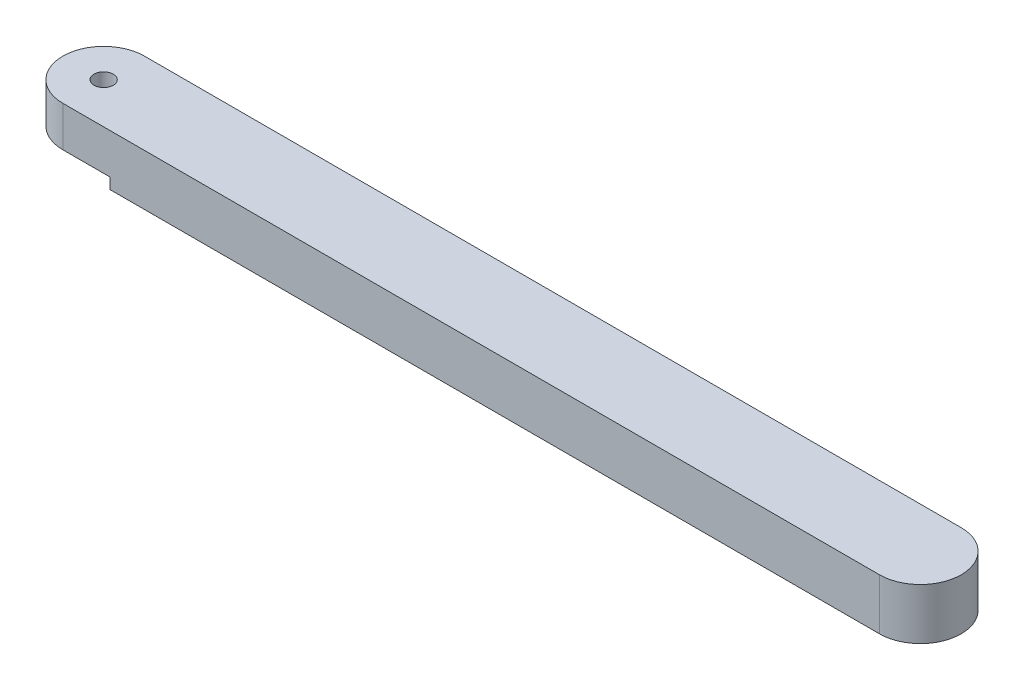
ISO-10303-21;
HEADER;
FILE_DESCRIPTION(('STEP AP214'),'2;1');
FILE_NAME('part.step','',(''),(''),'','','');
FILE_SCHEMA(('AUTOMOTIVE_DESIGN { 1 0 10303 214 1 1 1 1 }'));
ENDSEC;
DATA;
#1=APPLICATION_CONTEXT('core data for automotive mechanical design processes');
#2=APPLICATION_PROTOCOL_DEFINITION('international standard','automotive_design',2000,#1);
#3=PRODUCT_CONTEXT('',#1,'mechanical');
#4=PRODUCT('Part','Part','',(#3));
#5=PRODUCT_RELATED_PRODUCT_CATEGORY('part','',(#4));
#6=PRODUCT_DEFINITION_FORMATION('','',#4);
#7=PRODUCT_DEFINITION_CONTEXT('part definition',#1,'design');
#8=PRODUCT_DEFINITION('design','',#6,#7);
#9=PRODUCT_DEFINITION_SHAPE('','',#8);
#10=(LENGTH_UNIT() NAMED_UNIT(*) SI_UNIT(.MILLI.,.METRE.));
#11=(NAMED_UNIT(*) PLANE_ANGLE_UNIT() SI_UNIT($,.RADIAN.));
#12=(NAMED_UNIT(*) SI_UNIT($,.STERADIAN.) SOLID_ANGLE_UNIT());
#13=UNCERTAINTY_MEASURE_WITH_UNIT(LENGTH_MEASURE(1.E-05),#10,'distance_accuracy_value','');
#14=(GEOMETRIC_REPRESENTATION_CONTEXT(3) GLOBAL_UNCERTAINTY_ASSIGNED_CONTEXT((#13)) GLOBAL_UNIT_ASSIGNED_CONTEXT((#10,
#11,#12)) REPRESENTATION_CONTEXT('',''));
#15=CARTESIAN_POINT('',(0.,0.,0.));
#16=DIRECTION('',(0.,0.,1.));
#17=DIRECTION('',(1.,0.,0.));
#18=AXIS2_PLACEMENT_3D('',#15,#16,#17);
#19=CARTESIAN_POINT('',(0.,11.938,0.));
#20=DIRECTION('',(0.,-1.,0.));
#21=DIRECTION('',(0.,0.,-1.));
#22=AXIS2_PLACEMENT_3D('',#19,#20,#21);
#23=CYLINDRICAL_SURFACE('',#22,9.525);
#24=CARTESIAN_POINT('',(0.,2.54,0.));
#25=DIRECTION('',(0.,-1.,0.));
#26=DIRECTION('',(0.,0.,-1.));
#27=AXIS2_PLACEMENT_3D('',#24,#25,#26);
#28=CIRCLE('',#27,9.525);
#29=CARTESIAN_POINT('',(0.,2.54,9.525));
#30=VERTEX_POINT('',#29);
#31=CARTESIAN_POINT('',(0.,2.54,-9.525));
#32=VERTEX_POINT('',#31);
#33=EDGE_CURVE('E134',#30,#32,#28,.T.);
#34=ORIENTED_EDGE('',*,*,#33,.F.);
#35=DIRECTION('',(0.,-1.,0.));
#36=VECTOR('',#35,1.);
#37=CARTESIAN_POINT('',(0.,11.938,9.525));
#38=LINE('',#37,#36);
#39=CARTESIAN_POINT('',(0.,11.938,9.525));
#40=VERTEX_POINT('',#39);
#41=EDGE_CURVE('E11',#40,#30,#38,.T.);
#42=ORIENTED_EDGE('',*,*,#41,.F.);
#43=CARTESIAN_POINT('',(0.,11.938,0.));
#44=DIRECTION('',(0.,1.,0.));
#45=DIRECTION('',(0.,0.,1.));
#46=AXIS2_PLACEMENT_3D('',#43,#44,#45);
#47=CIRCLE('',#46,9.525);
#48=CARTESIAN_POINT('',(0.,11.938,-9.525));
#49=VERTEX_POINT('',#48);
#50=EDGE_CURVE('E157',#49,#40,#47,.T.);
#51=ORIENTED_EDGE('',*,*,#50,.F.);
#52=DIRECTION('',(0.,-1.,0.));
#53=VECTOR('',#52,1.);
#54=CARTESIAN_POINT('',(0.,11.938,-9.525));
#55=LINE('',#54,#53);
#56=EDGE_CURVE('E152',#49,#32,#55,.T.);
#57=ORIENTED_EDGE('',*,*,#56,.T.);
#58=EDGE_LOOP('',(#34,#42,#51,#57));
#59=FACE_BOUND('',#58,.T.);
#60=ADVANCED_FACE('F45',(#59),#23,.T.);
#61=CARTESIAN_POINT('',(0.,11.938,0.));
#62=DIRECTION('',(0.,1.,0.));
#63=DIRECTION('',(0.,0.,1.));
#64=AXIS2_PLACEMENT_3D('',#61,#62,#63);
#65=CYLINDRICAL_SURFACE('',#64,2.25);
#66=CARTESIAN_POINT('',(0.,11.938,0.));
#67=DIRECTION('',(0.,1.,0.));
#68=DIRECTION('',(0.,0.,1.));
#69=AXIS2_PLACEMENT_3D('',#66,#67,#68);
#70=CIRCLE('',#69,2.24999999999999);
#71=CARTESIAN_POINT('',(0.,11.938,2.24999999999999));
#72=VERTEX_POINT('',#71);
#73=EDGE_CURVE('E182',#72,#72,#70,.T.);
#74=ORIENTED_EDGE('',*,*,#73,.T.);
#75=EDGE_LOOP('',(#74));
#76=FACE_BOUND('',#75,.T.);
#77=CARTESIAN_POINT('',(0.,2.54,0.));
#78=DIRECTION('',(0.,-1.,0.));
#79=DIRECTION('',(0.,0.,-1.));
#80=AXIS2_PLACEMENT_3D('',#77,#78,#79);
#81=CIRCLE('',#80,2.25);
#82=CARTESIAN_POINT('',(0.,2.54,-2.25));
#83=VERTEX_POINT('',#82);
#84=EDGE_CURVE('E48',#83,#83,#81,.F.);
#85=ORIENTED_EDGE('',*,*,#84,.F.);
#86=EDGE_LOOP('',(#85));
#87=FACE_BOUND('',#86,.T.);
#88=ADVANCED_FACE('F265',(#76,#87),#65,.F.);
#89=CARTESIAN_POINT('',(0.,11.938,9.525));
#90=DIRECTION('',(0.,0.,-1.));
#91=DIRECTION('',(-1.,0.,0.));
#92=AXIS2_PLACEMENT_3D('',#89,#90,#91);
#93=PLANE('',#92);
#94=DIRECTION('',(-1.,0.,0.));
#95=VECTOR('',#94,1.);
#96=CARTESIAN_POINT('',(10.9727256240947,2.54,9.525));
#97=LINE('',#96,#95);
#98=CARTESIAN_POINT('',(10.9727256240947,2.54,9.525));
#99=VERTEX_POINT('',#98);
#100=EDGE_CURVE('E142',#99,#30,#97,.T.);
#101=ORIENTED_EDGE('',*,*,#100,.F.);
#102=DIRECTION('',(0.,-1.,0.));
#103=VECTOR('',#102,1.);
#104=CARTESIAN_POINT('',(10.9727256240947,2.54,9.525));
#105=LINE('',#104,#103);
#106=CARTESIAN_POINT('',(10.9727256240947,0.,9.525));
#107=VERTEX_POINT('',#106);
#108=EDGE_CURVE('E208',#99,#107,#105,.T.);
#109=ORIENTED_EDGE('',*,*,#108,.T.);
#110=DIRECTION('',(1.,0.,0.));
#111=VECTOR('',#110,1.);
#112=CARTESIAN_POINT('',(0.,0.,9.525));
#113=LINE('',#112,#111);
#114=CARTESIAN_POINT('',(190.5,0.,9.525));
#115=VERTEX_POINT('',#114);
#116=EDGE_CURVE('E178',#107,#115,#113,.T.);
#117=ORIENTED_EDGE('',*,*,#116,.T.);
#118=DIRECTION('',(0.,-1.,0.));
#119=VECTOR('',#118,1.);
#120=CARTESIAN_POINT('',(190.5,11.938,9.525));
#121=LINE('',#120,#119);
#122=CARTESIAN_POINT('',(190.5,11.938,9.525));
#123=VERTEX_POINT('',#122);
#124=EDGE_CURVE('E54',#123,#115,#121,.T.);
#125=ORIENTED_EDGE('',*,*,#124,.F.);
#126=DIRECTION('',(1.,0.,0.));
#127=VECTOR('',#126,1.);
#128=CARTESIAN_POINT('',(0.,11.938,9.525));
#129=LINE('',#128,#127);
#130=EDGE_CURVE('E93',#40,#123,#129,.T.);
#131=ORIENTED_EDGE('',*,*,#130,.F.);
#132=ORIENTED_EDGE('',*,*,#41,.T.);
#133=EDGE_LOOP('',(#101,#109,#117,#125,#131,#132));
#134=FACE_BOUND('',#133,.T.);
#135=ADVANCED_FACE('F263',(#134),#93,.F.);
#136=CARTESIAN_POINT('',(190.5,11.938,0.));
#137=DIRECTION('',(0.,-1.,0.));
#138=DIRECTION('',(0.,0.,-1.));
#139=AXIS2_PLACEMENT_3D('',#136,#137,#138);
#140=CYLINDRICAL_SURFACE('',#139,9.525);
#141=CARTESIAN_POINT('',(190.5,0.,0.));
#142=DIRECTION('',(0.,1.,0.));
#143=DIRECTION('',(0.,0.,1.));
#144=AXIS2_PLACEMENT_3D('',#141,#142,#143);
#145=CIRCLE('',#144,9.525);
#146=CARTESIAN_POINT('',(190.5,0.,-9.525));
#147=VERTEX_POINT('',#146);
#148=EDGE_CURVE('E86',#115,#147,#145,.T.);
#149=ORIENTED_EDGE('',*,*,#148,.T.);
#150=DIRECTION('',(0.,-1.,0.));
#151=VECTOR('',#150,1.);
#152=CARTESIAN_POINT('',(190.5,11.938,-9.525));
#153=LINE('',#152,#151);
#154=CARTESIAN_POINT('',(190.5,11.938,-9.525));
#155=VERTEX_POINT('',#154);
#156=EDGE_CURVE('E159',#155,#147,#153,.T.);
#157=ORIENTED_EDGE('',*,*,#156,.F.);
#158=CARTESIAN_POINT('',(190.5,11.938,0.));
#159=DIRECTION('',(0.,1.,0.));
#160=DIRECTION('',(0.,0.,1.));
#161=AXIS2_PLACEMENT_3D('',#158,#159,#160);
#162=CIRCLE('',#161,9.525);
#163=EDGE_CURVE('E164',#123,#155,#162,.T.);
#164=ORIENTED_EDGE('',*,*,#163,.F.);
#165=ORIENTED_EDGE('',*,*,#124,.T.);
#166=EDGE_LOOP('',(#149,#157,#164,#165));
#167=FACE_BOUND('',#166,.T.);
#168=ADVANCED_FACE('F172',(#167),#140,.T.);
#169=CARTESIAN_POINT('',(0.,11.938,-9.525));
#170=DIRECTION('',(0.,0.,1.));
#171=DIRECTION('',(1.,0.,0.));
#172=AXIS2_PLACEMENT_3D('',#169,#170,#171);
#173=PLANE('',#172);
#174=DIRECTION('',(-1.,0.,0.));
#175=VECTOR('',#174,1.);
#176=CARTESIAN_POINT('',(0.,0.,-9.525));
#177=LINE('',#176,#175);
#178=CARTESIAN_POINT('',(10.9727256240947,0.,-9.525));
#179=VERTEX_POINT('',#178);
#180=EDGE_CURVE('E167',#147,#179,#177,.T.);
#181=ORIENTED_EDGE('',*,*,#180,.T.);
#182=DIRECTION('',(0.,-1.,0.));
#183=VECTOR('',#182,1.);
#184=CARTESIAN_POINT('',(10.9727256240947,2.54,-9.525));
#185=LINE('',#184,#183);
#186=CARTESIAN_POINT('',(10.9727256240947,2.54,-9.525));
#187=VERTEX_POINT('',#186);
#188=EDGE_CURVE('E61',#187,#179,#185,.T.);
#189=ORIENTED_EDGE('',*,*,#188,.F.);
#190=DIRECTION('',(1.,0.,0.));
#191=VECTOR('',#190,1.);
#192=CARTESIAN_POINT('',(10.9727256240947,2.54,-9.525));
#193=LINE('',#192,#191);
#194=EDGE_CURVE('E139',#32,#187,#193,.T.);
#195=ORIENTED_EDGE('',*,*,#194,.F.);
#196=ORIENTED_EDGE('',*,*,#56,.F.);
#197=DIRECTION('',(-1.,0.,0.));
#198=VECTOR('',#197,1.);
#199=CARTESIAN_POINT('',(0.,11.938,-9.525));
#200=LINE('',#199,#198);
#201=EDGE_CURVE('E70',#155,#49,#200,.T.);
#202=ORIENTED_EDGE('',*,*,#201,.F.);
#203=ORIENTED_EDGE('',*,*,#156,.T.);
#204=EDGE_LOOP('',(#181,#189,#195,#196,#202,#203));
#205=FACE_BOUND('',#204,.T.);
#206=ADVANCED_FACE('F151',(#205),#173,.F.);
#207=CARTESIAN_POINT('',(0.,11.938,0.));
#208=DIRECTION('',(0.,1.,0.));
#209=DIRECTION('',(0.,0.,1.));
#210=AXIS2_PLACEMENT_3D('',#207,#208,#209);
#211=PLANE('',#210);
#212=ORIENTED_EDGE('',*,*,#73,.F.);
#213=EDGE_LOOP('',(#212));
#214=FACE_BOUND('',#213,.T.);
#215=ORIENTED_EDGE('',*,*,#50,.T.);
#216=ORIENTED_EDGE('',*,*,#130,.T.);
#217=ORIENTED_EDGE('',*,*,#163,.T.);
#218=ORIENTED_EDGE('',*,*,#201,.T.);
#219=EDGE_LOOP('',(#215,#216,#217,#218));
#220=FACE_BOUND('',#219,.T.);
#221=ADVANCED_FACE('F282',(#214,#220),#211,.T.);
#222=CARTESIAN_POINT('',(0.,0.,0.));
#223=DIRECTION('',(0.,1.,0.));
#224=DIRECTION('',(0.,0.,1.));
#225=AXIS2_PLACEMENT_3D('',#222,#223,#224);
#226=PLANE('',#225);
#227=ORIENTED_EDGE('',*,*,#116,.F.);
#228=DIRECTION('',(0.,0.,1.));
#229=VECTOR('',#228,1.);
#230=CARTESIAN_POINT('',(10.9727256240947,0.,6.985));
#231=LINE('',#230,#229);
#232=CARTESIAN_POINT('',(10.9727256240947,0.,6.985));
#233=VERTEX_POINT('',#232);
#234=EDGE_CURVE('E147',#233,#107,#231,.T.);
#235=ORIENTED_EDGE('',*,*,#234,.F.);
#236=DIRECTION('',(-0.342020143325669,0.,0.939692620785908));
#237=VECTOR('',#236,1.);
#238=CARTESIAN_POINT('',(11.934096283981,0.,4.34365582023601));
#239=LINE('',#238,#237);
#240=CARTESIAN_POINT('',(11.934096283981,0.,4.34365582023601));
#241=VERTEX_POINT('',#240);
#242=EDGE_CURVE('E214',#241,#233,#239,.T.);
#243=ORIENTED_EDGE('',*,*,#242,.F.);
#244=CARTESIAN_POINT('',(0.,0.,0.));
#245=DIRECTION('',(0.,-1.,0.));
#246=DIRECTION('',(0.,0.,-1.));
#247=AXIS2_PLACEMENT_3D('',#244,#245,#246);
#248=CIRCLE('',#247,12.7);
#249=CARTESIAN_POINT('',(11.934096283981,0.,-4.343655820236));
#250=VERTEX_POINT('',#249);
#251=EDGE_CURVE('E218',#250,#241,#248,.T.);
#252=ORIENTED_EDGE('',*,*,#251,.F.);
#253=DIRECTION('',(0.342020143325668,0.,0.939692620785908));
#254=VECTOR('',#253,1.);
#255=CARTESIAN_POINT('',(11.934096283981,0.,-4.343655820236));
#256=LINE('',#255,#254);
#257=CARTESIAN_POINT('',(10.9727256240947,0.,-6.985));
#258=VERTEX_POINT('',#257);
#259=EDGE_CURVE('E222',#258,#250,#256,.T.);
#260=ORIENTED_EDGE('',*,*,#259,.F.);
#261=DIRECTION('',(0.,0.,1.));
#262=VECTOR('',#261,1.);
#263=CARTESIAN_POINT('',(10.9727256240947,0.,-6.985));
#264=LINE('',#263,#262);
#265=EDGE_CURVE('E226',#179,#258,#264,.T.);
#266=ORIENTED_EDGE('',*,*,#265,.F.);
#267=ORIENTED_EDGE('',*,*,#180,.F.);
#268=ORIENTED_EDGE('',*,*,#148,.F.);
#269=EDGE_LOOP('',(#227,#235,#243,#252,#260,#266,#267,#268));
#270=FACE_BOUND('',#269,.T.);
#271=ADVANCED_FACE('F176',(#270),#226,.F.);
#272=CARTESIAN_POINT('',(0.,2.54,0.));
#273=DIRECTION('',(0.,-1.,0.));
#274=DIRECTION('',(0.,0.,-1.));
#275=AXIS2_PLACEMENT_3D('',#272,#273,#274);
#276=PLANE('',#275);
#277=ORIENTED_EDGE('',*,*,#33,.T.);
#278=ORIENTED_EDGE('',*,*,#194,.T.);
#279=DIRECTION('',(0.,0.,1.));
#280=VECTOR('',#279,1.);
#281=CARTESIAN_POINT('',(10.9727256240947,2.54,-6.985));
#282=LINE('',#281,#280);
#283=CARTESIAN_POINT('',(10.9727256240947,2.54,-6.985));
#284=VERTEX_POINT('',#283);
#285=EDGE_CURVE('E155',#187,#284,#282,.T.);
#286=ORIENTED_EDGE('',*,*,#285,.T.);
#287=DIRECTION('',(0.342020143325668,0.,0.939692620785908));
#288=VECTOR('',#287,1.);
#289=CARTESIAN_POINT('',(11.934096283981,2.54,-4.343655820236));
#290=LINE('',#289,#288);
#291=CARTESIAN_POINT('',(11.934096283981,2.54,-4.343655820236));
#292=VERTEX_POINT('',#291);
#293=EDGE_CURVE('E242',#284,#292,#290,.T.);
#294=ORIENTED_EDGE('',*,*,#293,.T.);
#295=CARTESIAN_POINT('',(0.,2.54,0.));
#296=DIRECTION('',(0.,-1.,0.));
#297=DIRECTION('',(0.,0.,-1.));
#298=AXIS2_PLACEMENT_3D('',#295,#296,#297);
#299=CIRCLE('',#298,12.7);
#300=CARTESIAN_POINT('',(11.934096283981,2.54,4.34365582023601));
#301=VERTEX_POINT('',#300);
#302=EDGE_CURVE('E238',#292,#301,#299,.T.);
#303=ORIENTED_EDGE('',*,*,#302,.T.);
#304=DIRECTION('',(-0.342020143325669,0.,0.939692620785908));
#305=VECTOR('',#304,1.);
#306=CARTESIAN_POINT('',(11.934096283981,2.54,4.34365582023601));
#307=LINE('',#306,#305);
#308=CARTESIAN_POINT('',(10.9727256240947,2.54,6.985));
#309=VERTEX_POINT('',#308);
#310=EDGE_CURVE('E234',#301,#309,#307,.T.);
#311=ORIENTED_EDGE('',*,*,#310,.T.);
#312=DIRECTION('',(0.,0.,1.));
#313=VECTOR('',#312,1.);
#314=CARTESIAN_POINT('',(10.9727256240947,2.54,6.985));
#315=LINE('',#314,#313);
#316=EDGE_CURVE('E231',#309,#99,#315,.T.);
#317=ORIENTED_EDGE('',*,*,#316,.T.);
#318=ORIENTED_EDGE('',*,*,#100,.T.);
#319=EDGE_LOOP('',(#277,#278,#286,#294,#303,#311,#317,#318));
#320=FACE_BOUND('',#319,.T.);
#321=ORIENTED_EDGE('',*,*,#84,.T.);
#322=EDGE_LOOP('',(#321));
#323=FACE_BOUND('',#322,.T.);
#324=ADVANCED_FACE('F136',(#320,#323),#276,.T.);
#325=CARTESIAN_POINT('',(10.9727256240947,2.54,6.985));
#326=DIRECTION('',(1.,0.,0.));
#327=DIRECTION('',(0.,0.,-1.));
#328=AXIS2_PLACEMENT_3D('',#325,#326,#327);
#329=PLANE('',#328);
#330=ORIENTED_EDGE('',*,*,#234,.T.);
#331=ORIENTED_EDGE('',*,*,#108,.F.);
#332=ORIENTED_EDGE('',*,*,#316,.F.);
#333=DIRECTION('',(0.,-1.,0.));
#334=VECTOR('',#333,1.);
#335=CARTESIAN_POINT('',(10.9727256240947,2.54,6.985));
#336=LINE('',#335,#334);
#337=EDGE_CURVE('E205',#309,#233,#336,.T.);
#338=ORIENTED_EDGE('',*,*,#337,.T.);
#339=EDGE_LOOP('',(#330,#331,#332,#338));
#340=FACE_BOUND('',#339,.T.);
#341=ADVANCED_FACE('F262',(#340),#329,.F.);
#342=CARTESIAN_POINT('',(11.934096283981,2.54,4.34365582023601));
#343=DIRECTION('',(0.939692620785908,0.,0.342020143325669));
#344=DIRECTION('',(0.342020143325669,0.,-0.939692620785908));
#345=AXIS2_PLACEMENT_3D('',#342,#343,#344);
#346=PLANE('',#345);
#347=ORIENTED_EDGE('',*,*,#242,.T.);
#348=ORIENTED_EDGE('',*,*,#337,.F.);
#349=ORIENTED_EDGE('',*,*,#310,.F.);
#350=DIRECTION('',(0.,-1.,0.));
#351=VECTOR('',#350,1.);
#352=CARTESIAN_POINT('',(11.934096283981,2.54,4.34365582023601));
#353=LINE('',#352,#351);
#354=EDGE_CURVE('E202',#301,#241,#353,.T.);
#355=ORIENTED_EDGE('',*,*,#354,.T.);
#356=EDGE_LOOP('',(#347,#348,#349,#355));
#357=FACE_BOUND('',#356,.T.);
#358=ADVANCED_FACE('F259',(#357),#346,.F.);
#359=CARTESIAN_POINT('',(0.,2.54,0.));
#360=DIRECTION('',(0.,-1.,0.));
#361=DIRECTION('',(0.,0.,-1.));
#362=AXIS2_PLACEMENT_3D('',#359,#360,#361);
#363=CYLINDRICAL_SURFACE('',#362,12.7);
#364=ORIENTED_EDGE('',*,*,#251,.T.);
#365=ORIENTED_EDGE('',*,*,#354,.F.);
#366=ORIENTED_EDGE('',*,*,#302,.F.);
#367=DIRECTION('',(0.,-1.,0.));
#368=VECTOR('',#367,1.);
#369=CARTESIAN_POINT('',(11.934096283981,2.54,-4.343655820236));
#370=LINE('',#369,#368);
#371=EDGE_CURVE('E199',#292,#250,#370,.T.);
#372=ORIENTED_EDGE('',*,*,#371,.T.);
#373=EDGE_LOOP('',(#364,#365,#366,#372));
#374=FACE_BOUND('',#373,.T.);
#375=ADVANCED_FACE('F255',(#374),#363,.F.);
#376=CARTESIAN_POINT('',(11.934096283981,2.54,-4.343655820236));
#377=DIRECTION('',(0.939692620785909,0.,-0.342020143325669));
#378=DIRECTION('',(-0.342020143325669,0.,-0.939692620785909));
#379=AXIS2_PLACEMENT_3D('',#376,#377,#378);
#380=PLANE('',#379);
#381=ORIENTED_EDGE('',*,*,#259,.T.);
#382=ORIENTED_EDGE('',*,*,#371,.F.);
#383=ORIENTED_EDGE('',*,*,#293,.F.);
#384=DIRECTION('',(0.,-1.,0.));
#385=VECTOR('',#384,1.);
#386=CARTESIAN_POINT('',(10.9727256240947,2.54,-6.985));
#387=LINE('',#386,#385);
#388=EDGE_CURVE('E196',#284,#258,#387,.T.);
#389=ORIENTED_EDGE('',*,*,#388,.T.);
#390=EDGE_LOOP('',(#381,#382,#383,#389));
#391=FACE_BOUND('',#390,.T.);
#392=ADVANCED_FACE('F251',(#391),#380,.F.);
#393=CARTESIAN_POINT('',(10.9727256240947,2.54,-6.985));
#394=DIRECTION('',(1.,0.,0.));
#395=DIRECTION('',(0.,0.,-1.));
#396=AXIS2_PLACEMENT_3D('',#393,#394,#395);
#397=PLANE('',#396);
#398=ORIENTED_EDGE('',*,*,#265,.T.);
#399=ORIENTED_EDGE('',*,*,#388,.F.);
#400=ORIENTED_EDGE('',*,*,#285,.F.);
#401=ORIENTED_EDGE('',*,*,#188,.T.);
#402=EDGE_LOOP('',(#398,#399,#400,#401));
#403=FACE_BOUND('',#402,.T.);
#404=ADVANCED_FACE('F248',(#403),#397,.F.);
#405=CLOSED_SHELL('',(#60,#88,#135,#168,#206,#221,#271,#324,#341,#358,#375,#392,#404));
#406=MANIFOLD_SOLID_BREP('B2',#405);
#407=ADVANCED_BREP_SHAPE_REPRESENTATION('',(#18,#406),#14);
#408=SHAPE_DEFINITION_REPRESENTATION(#9,#407);
ENDSEC;
END-ISO-10303-21;
